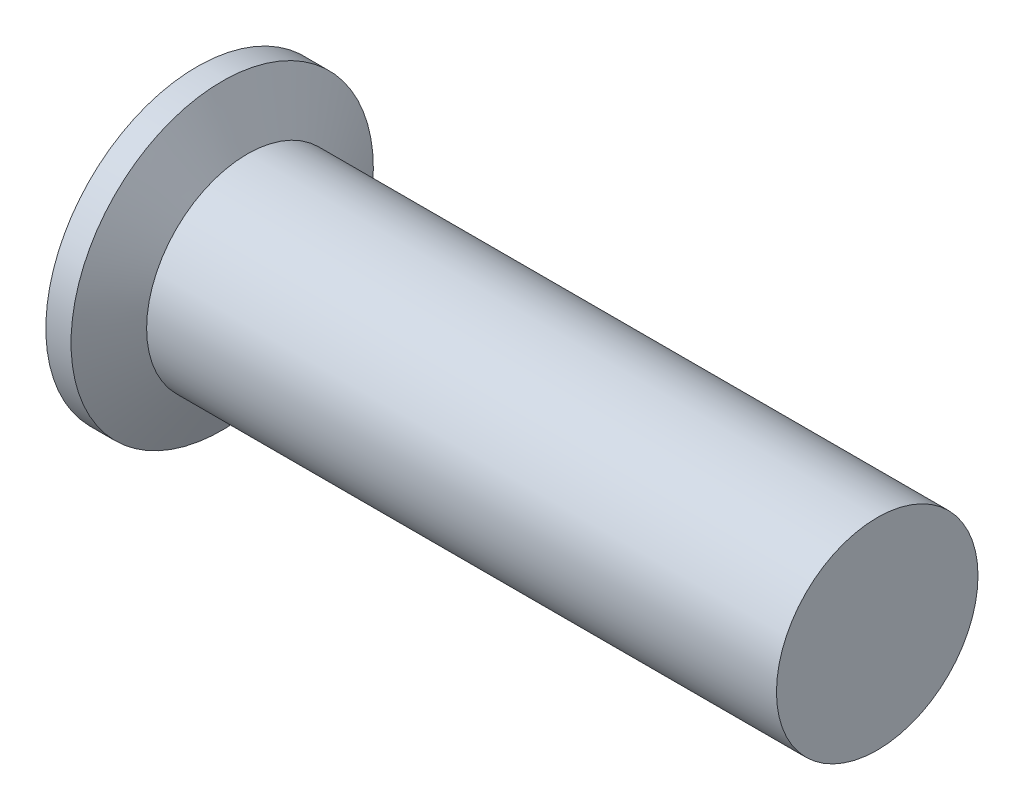
ISO-10303-21;
HEADER;
FILE_DESCRIPTION(('STEP AP214'),'2;1');
FILE_NAME('part.step','',(''),(''),'','','');
FILE_SCHEMA(('AUTOMOTIVE_DESIGN { 1 0 10303 214 1 1 1 1 }'));
ENDSEC;
DATA;
#1=APPLICATION_CONTEXT('core data for automotive mechanical design processes');
#2=APPLICATION_PROTOCOL_DEFINITION('international standard','automotive_design',2000,#1);
#3=PRODUCT_CONTEXT('',#1,'mechanical');
#4=PRODUCT('Part','Part','',(#3));
#5=PRODUCT_RELATED_PRODUCT_CATEGORY('part','',(#4));
#6=PRODUCT_DEFINITION_FORMATION('','',#4);
#7=PRODUCT_DEFINITION_CONTEXT('part definition',#1,'design');
#8=PRODUCT_DEFINITION('design','',#6,#7);
#9=PRODUCT_DEFINITION_SHAPE('','',#8);
#10=(LENGTH_UNIT() NAMED_UNIT(*) SI_UNIT(.MILLI.,.METRE.));
#11=(NAMED_UNIT(*) PLANE_ANGLE_UNIT() SI_UNIT($,.RADIAN.));
#12=(NAMED_UNIT(*) SI_UNIT($,.STERADIAN.) SOLID_ANGLE_UNIT());
#13=UNCERTAINTY_MEASURE_WITH_UNIT(LENGTH_MEASURE(1.E-05),#10,'distance_accuracy_value','');
#14=(GEOMETRIC_REPRESENTATION_CONTEXT(3) GLOBAL_UNCERTAINTY_ASSIGNED_CONTEXT((#13)) GLOBAL_UNIT_ASSIGNED_CONTEXT((#10,
#11,#12)) REPRESENTATION_CONTEXT('',''));
#15=CARTESIAN_POINT('',(0.,0.,0.));
#16=DIRECTION('',(0.,0.,1.));
#17=DIRECTION('',(1.,0.,0.));
#18=AXIS2_PLACEMENT_3D('',#15,#16,#17);
#19=CARTESIAN_POINT('',(1.,0.,0.));
#20=DIRECTION('',(-1.,0.,0.));
#21=DIRECTION('',(0.,0.,1.));
#22=AXIS2_PLACEMENT_3D('',#19,#20,#21);
#23=CYLINDRICAL_SURFACE('',#22,3.);
#24=CARTESIAN_POINT('',(0.,0.,0.));
#25=DIRECTION('',(1.,0.,0.));
#26=DIRECTION('',(0.,0.,-1.));
#27=AXIS2_PLACEMENT_3D('',#24,#25,#26);
#28=CIRCLE('',#27,3.);
#29=CARTESIAN_POINT('',(0.,0.,-3.));
#30=VERTEX_POINT('',#29);
#31=EDGE_CURVE('E10',#30,#30,#28,.T.);
#32=ORIENTED_EDGE('',*,*,#31,.T.);
#33=EDGE_LOOP('',(#32));
#34=FACE_BOUND('',#33,.T.);
#35=CARTESIAN_POINT('',(0.5,0.,0.));
#36=DIRECTION('',(1.,0.,0.));
#37=DIRECTION('',(0.,0.,-1.));
#38=AXIS2_PLACEMENT_3D('',#35,#36,#37);
#39=CIRCLE('',#38,3.);
#40=CARTESIAN_POINT('',(0.5,0.,-3.));
#41=VERTEX_POINT('',#40);
#42=EDGE_CURVE('E52',#41,#41,#39,.T.);
#43=ORIENTED_EDGE('',*,*,#42,.F.);
#44=EDGE_LOOP('',(#43));
#45=FACE_BOUND('',#44,.T.);
#46=ADVANCED_FACE('F39',(#34,#45),#23,.T.);
#47=CARTESIAN_POINT('',(0.,0.,0.));
#48=DIRECTION('',(1.,0.,0.));
#49=DIRECTION('',(0.,0.,-1.));
#50=AXIS2_PLACEMENT_3D('',#47,#48,#49);
#51=PLANE('',#50);
#52=ORIENTED_EDGE('',*,*,#31,.F.);
#53=EDGE_LOOP('',(#52));
#54=FACE_BOUND('',#53,.T.);
#55=ADVANCED_FACE('F64',(#54),#51,.F.);
#56=CARTESIAN_POINT('',(0.999999999999999,0.,0.));
#57=DIRECTION('',(-1.,0.,0.));
#58=DIRECTION('',(0.,0.,1.));
#59=AXIS2_PLACEMENT_3D('',#56,#57,#58);
#60=CONICAL_SURFACE('',#59,2.,1.10714871779409);
#61=ORIENTED_EDGE('',*,*,#42,.T.);
#62=EDGE_LOOP('',(#61));
#63=FACE_BOUND('',#62,.T.);
#64=CARTESIAN_POINT('',(0.999999999999999,0.,0.));
#65=DIRECTION('',(1.,0.,0.));
#66=DIRECTION('',(0.,0.,-1.));
#67=AXIS2_PLACEMENT_3D('',#64,#65,#66);
#68=CIRCLE('',#67,2.);
#69=CARTESIAN_POINT('',(0.999999999999999,0.,-2.));
#70=VERTEX_POINT('',#69);
#71=EDGE_CURVE('E47',#70,#70,#68,.T.);
#72=ORIENTED_EDGE('',*,*,#71,.F.);
#73=EDGE_LOOP('',(#72));
#74=FACE_BOUND('',#73,.T.);
#75=ADVANCED_FACE('F56',(#63,#74),#60,.T.);
#76=CARTESIAN_POINT('',(13.5,0.,0.));
#77=DIRECTION('',(1.,0.,0.));
#78=DIRECTION('',(0.,0.,-1.));
#79=AXIS2_PLACEMENT_3D('',#76,#77,#78);
#80=PLANE('',#79);
#81=CARTESIAN_POINT('',(13.5,0.,0.));
#82=DIRECTION('',(1.,0.,0.));
#83=DIRECTION('',(0.,0.,-1.));
#84=AXIS2_PLACEMENT_3D('',#81,#82,#83);
#85=CIRCLE('',#84,2.);
#86=CARTESIAN_POINT('',(13.5,0.,-2.));
#87=VERTEX_POINT('',#86);
#88=EDGE_CURVE('E44',#87,#87,#85,.T.);
#89=ORIENTED_EDGE('',*,*,#88,.T.);
#90=EDGE_LOOP('',(#89));
#91=FACE_BOUND('',#90,.T.);
#92=ADVANCED_FACE('F75',(#91),#80,.T.);
#93=CARTESIAN_POINT('',(13.5,0.,0.));
#94=DIRECTION('',(-1.,0.,0.));
#95=DIRECTION('',(0.,0.,1.));
#96=AXIS2_PLACEMENT_3D('',#93,#94,#95);
#97=CYLINDRICAL_SURFACE('',#96,2.);
#98=ORIENTED_EDGE('',*,*,#71,.T.);
#99=EDGE_LOOP('',(#98));
#100=FACE_BOUND('',#99,.T.);
#101=ORIENTED_EDGE('',*,*,#88,.F.);
#102=EDGE_LOOP('',(#101));
#103=FACE_BOUND('',#102,.T.);
#104=ADVANCED_FACE('F77',(#100,#103),#97,.T.);
#105=CLOSED_SHELL('',(#46,#55,#75,#92,#104));
#106=MANIFOLD_SOLID_BREP('B2',#105);
#107=ADVANCED_BREP_SHAPE_REPRESENTATION('',(#18,#106),#14);
#108=SHAPE_DEFINITION_REPRESENTATION(#9,#107);
ENDSEC;
END-ISO-10303-21;
